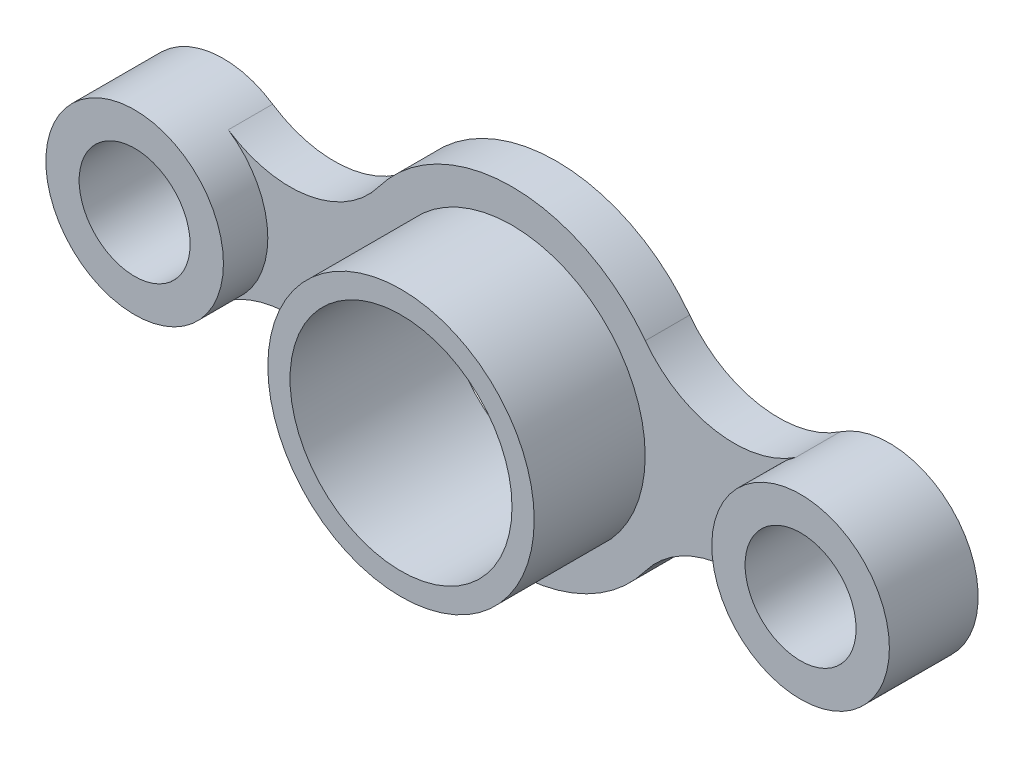
ISO-10303-21;
HEADER;
FILE_DESCRIPTION(('STEP AP214'),'2;1');
FILE_NAME('part.step','',(''),(''),'','','');
FILE_SCHEMA(('AUTOMOTIVE_DESIGN { 1 0 10303 214 1 1 1 1 }'));
ENDSEC;
DATA;
#1=APPLICATION_CONTEXT('core data for automotive mechanical design processes');
#2=APPLICATION_PROTOCOL_DEFINITION('international standard','automotive_design',2000,#1);
#3=PRODUCT_CONTEXT('',#1,'mechanical');
#4=PRODUCT('Part','Part','',(#3));
#5=PRODUCT_RELATED_PRODUCT_CATEGORY('part','',(#4));
#6=PRODUCT_DEFINITION_FORMATION('','',#4);
#7=PRODUCT_DEFINITION_CONTEXT('part definition',#1,'design');
#8=PRODUCT_DEFINITION('design','',#6,#7);
#9=PRODUCT_DEFINITION_SHAPE('','',#8);
#10=(LENGTH_UNIT() NAMED_UNIT(*) SI_UNIT(.MILLI.,.METRE.));
#11=(NAMED_UNIT(*) PLANE_ANGLE_UNIT() SI_UNIT($,.RADIAN.));
#12=(NAMED_UNIT(*) SI_UNIT($,.STERADIAN.) SOLID_ANGLE_UNIT());
#13=UNCERTAINTY_MEASURE_WITH_UNIT(LENGTH_MEASURE(1.E-05),#10,'distance_accuracy_value','');
#14=(GEOMETRIC_REPRESENTATION_CONTEXT(3) GLOBAL_UNCERTAINTY_ASSIGNED_CONTEXT((#13)) GLOBAL_UNIT_ASSIGNED_CONTEXT((#10,
#11,#12)) REPRESENTATION_CONTEXT('',''));
#15=CARTESIAN_POINT('',(0.,0.,0.));
#16=DIRECTION('',(0.,0.,1.));
#17=DIRECTION('',(1.,0.,0.));
#18=AXIS2_PLACEMENT_3D('',#15,#16,#17);
#19=CARTESIAN_POINT('',(-100.083333333333,-74.8887600971527,20.));
#20=DIRECTION('',(0.,0.,-1.));
#21=DIRECTION('',(-1.,0.,0.));
#22=AXIS2_PLACEMENT_3D('',#19,#20,#21);
#23=CYLINDRICAL_SURFACE('',#22,50.);
#24=CARTESIAN_POINT('',(-100.083333333333,-74.8887600971527,0.));
#25=DIRECTION('',(0.,0.,1.));
#26=DIRECTION('',(1.,0.,0.));
#27=AXIS2_PLACEMENT_3D('',#24,#25,#26);
#28=CIRCLE('',#27,50.);
#29=CARTESIAN_POINT('',(-127.814814814815,-33.2838933765123,0.));
#30=VERTEX_POINT('',#29);
#31=CARTESIAN_POINT('',(-60.05,-44.9332560582916,0.));
#32=VERTEX_POINT('',#31);
#33=EDGE_CURVE('E160',#30,#32,#28,.F.);
#34=ORIENTED_EDGE('',*,*,#33,.T.);
#35=DIRECTION('',(0.,0.,-1.));
#36=VECTOR('',#35,1.);
#37=CARTESIAN_POINT('',(-60.05,-44.9332560582916,20.));
#38=LINE('',#37,#36);
#39=CARTESIAN_POINT('',(-60.05,-44.9332560582916,20.));
#40=VERTEX_POINT('',#39);
#41=EDGE_CURVE('E48',#40,#32,#38,.T.);
#42=ORIENTED_EDGE('',*,*,#41,.F.);
#43=CARTESIAN_POINT('',(-100.083333333333,-74.8887600971527,20.));
#44=DIRECTION('',(0.,0.,1.));
#45=DIRECTION('',(1.,0.,0.));
#46=AXIS2_PLACEMENT_3D('',#43,#44,#45);
#47=CIRCLE('',#46,50.);
#48=CARTESIAN_POINT('',(-127.814814814815,-33.2838933765123,20.));
#49=VERTEX_POINT('',#48);
#50=EDGE_CURVE('E89',#49,#40,#47,.F.);
#51=ORIENTED_EDGE('',*,*,#50,.F.);
#52=DIRECTION('',(0.,0.,-1.));
#53=VECTOR('',#52,1.);
#54=CARTESIAN_POINT('',(-127.814814814815,-33.2838933765123,20.));
#55=LINE('',#54,#53);
#56=EDGE_CURVE('E11',#49,#30,#55,.T.);
#57=ORIENTED_EDGE('',*,*,#56,.T.);
#58=EDGE_LOOP('',(#34,#42,#51,#57));
#59=FACE_BOUND('',#58,.T.);
#60=ADVANCED_FACE('F39',(#59),#23,.F.);
#61=CARTESIAN_POINT('',(0.,0.,20.));
#62=DIRECTION('',(0.,0.,-1.));
#63=DIRECTION('',(-1.,0.,0.));
#64=AXIS2_PLACEMENT_3D('',#61,#62,#63);
#65=CYLINDRICAL_SURFACE('',#64,75.);
#66=CARTESIAN_POINT('',(0.,0.,0.));
#67=DIRECTION('',(0.,0.,1.));
#68=DIRECTION('',(1.,0.,0.));
#69=AXIS2_PLACEMENT_3D('',#66,#67,#68);
#70=CIRCLE('',#69,75.);
#71=CARTESIAN_POINT('',(60.05,-44.9332560582916,0.));
#72=VERTEX_POINT('',#71);
#73=EDGE_CURVE('E226',#32,#72,#70,.T.);
#74=ORIENTED_EDGE('',*,*,#73,.T.);
#75=DIRECTION('',(0.,0.,-1.));
#76=VECTOR('',#75,1.);
#77=CARTESIAN_POINT('',(60.05,-44.9332560582916,20.));
#78=LINE('',#77,#76);
#79=CARTESIAN_POINT('',(60.05,-44.9332560582916,20.));
#80=VERTEX_POINT('',#79);
#81=EDGE_CURVE('E231',#80,#72,#78,.T.);
#82=ORIENTED_EDGE('',*,*,#81,.F.);
#83=CARTESIAN_POINT('',(0.,0.,20.));
#84=DIRECTION('',(0.,0.,1.));
#85=DIRECTION('',(1.,0.,0.));
#86=AXIS2_PLACEMENT_3D('',#83,#84,#85);
#87=CIRCLE('',#86,75.);
#88=EDGE_CURVE('E129',#40,#80,#87,.T.);
#89=ORIENTED_EDGE('',*,*,#88,.F.);
#90=ORIENTED_EDGE('',*,*,#41,.T.);
#91=EDGE_LOOP('',(#74,#82,#89,#90));
#92=FACE_BOUND('',#91,.T.);
#93=ADVANCED_FACE('F212',(#92),#65,.T.);
#94=CARTESIAN_POINT('',(100.083333333333,-74.8887600971527,20.));
#95=DIRECTION('',(0.,0.,-1.));
#96=DIRECTION('',(-1.,0.,0.));
#97=AXIS2_PLACEMENT_3D('',#94,#95,#96);
#98=CYLINDRICAL_SURFACE('',#97,50.);
#99=CARTESIAN_POINT('',(100.083333333333,-74.8887600971527,0.));
#100=DIRECTION('',(0.,0.,1.));
#101=DIRECTION('',(1.,0.,0.));
#102=AXIS2_PLACEMENT_3D('',#99,#100,#101);
#103=CIRCLE('',#102,50.);
#104=CARTESIAN_POINT('',(127.814814814815,-33.2838933765123,0.));
#105=VERTEX_POINT('',#104);
#106=EDGE_CURVE('E235',#105,#72,#103,.T.);
#107=ORIENTED_EDGE('',*,*,#106,.F.);
#108=DIRECTION('',(0.,0.,-1.));
#109=VECTOR('',#108,1.);
#110=CARTESIAN_POINT('',(127.814814814815,-33.2838933765123,20.));
#111=LINE('',#110,#109);
#112=CARTESIAN_POINT('',(127.814814814815,-33.2838933765123,20.));
#113=VERTEX_POINT('',#112);
#114=EDGE_CURVE('E253',#113,#105,#111,.T.);
#115=ORIENTED_EDGE('',*,*,#114,.F.);
#116=CARTESIAN_POINT('',(100.083333333333,-74.8887600971527,20.));
#117=DIRECTION('',(0.,0.,1.));
#118=DIRECTION('',(1.,0.,0.));
#119=AXIS2_PLACEMENT_3D('',#116,#117,#118);
#120=CIRCLE('',#119,50.);
#121=EDGE_CURVE('E136',#113,#80,#120,.T.);
#122=ORIENTED_EDGE('',*,*,#121,.T.);
#123=ORIENTED_EDGE('',*,*,#81,.T.);
#124=EDGE_LOOP('',(#107,#115,#122,#123));
#125=FACE_BOUND('',#124,.T.);
#126=ADVANCED_FACE('F216',(#125),#98,.F.);
#127=CARTESIAN_POINT('',(100.083333333333,74.8887600971527,20.));
#128=DIRECTION('',(0.,0.,-1.));
#129=DIRECTION('',(-1.,0.,0.));
#130=AXIS2_PLACEMENT_3D('',#127,#128,#129);
#131=CYLINDRICAL_SURFACE('',#130,50.);
#132=CARTESIAN_POINT('',(100.083333333333,74.8887600971527,0.));
#133=DIRECTION('',(0.,0.,1.));
#134=DIRECTION('',(1.,0.,0.));
#135=AXIS2_PLACEMENT_3D('',#132,#133,#134);
#136=CIRCLE('',#135,50.);
#137=CARTESIAN_POINT('',(127.814814814815,33.2838933765123,0.));
#138=VERTEX_POINT('',#137);
#139=CARTESIAN_POINT('',(60.05,44.9332560582916,0.));
#140=VERTEX_POINT('',#139);
#141=EDGE_CURVE('E119',#138,#140,#136,.F.);
#142=ORIENTED_EDGE('',*,*,#141,.T.);
#143=DIRECTION('',(0.,0.,-1.));
#144=VECTOR('',#143,1.);
#145=CARTESIAN_POINT('',(60.05,44.9332560582916,20.));
#146=LINE('',#145,#144);
#147=CARTESIAN_POINT('',(60.05,44.9332560582916,20.));
#148=VERTEX_POINT('',#147);
#149=EDGE_CURVE('E116',#148,#140,#146,.T.);
#150=ORIENTED_EDGE('',*,*,#149,.F.);
#151=CARTESIAN_POINT('',(100.083333333333,74.8887600971527,20.));
#152=DIRECTION('',(0.,0.,1.));
#153=DIRECTION('',(1.,0.,0.));
#154=AXIS2_PLACEMENT_3D('',#151,#152,#153);
#155=CIRCLE('',#154,50.);
#156=CARTESIAN_POINT('',(127.814814814815,33.2838933765123,20.));
#157=VERTEX_POINT('',#156);
#158=EDGE_CURVE('E101',#157,#148,#155,.F.);
#159=ORIENTED_EDGE('',*,*,#158,.F.);
#160=DIRECTION('',(0.,0.,-1.));
#161=VECTOR('',#160,1.);
#162=CARTESIAN_POINT('',(127.814814814815,33.2838933765123,20.));
#163=LINE('',#162,#161);
#164=EDGE_CURVE('E123',#157,#138,#163,.T.);
#165=ORIENTED_EDGE('',*,*,#164,.T.);
#166=EDGE_LOOP('',(#142,#150,#159,#165));
#167=FACE_BOUND('',#166,.T.);
#168=ADVANCED_FACE('F117',(#167),#131,.F.);
#169=CARTESIAN_POINT('',(-60.05,44.9332560582916,0.));
#170=VERTEX_POINT('',#169);
#171=EDGE_CURVE('E238',#140,#170,#70,.T.);
#172=ORIENTED_EDGE('',*,*,#171,.T.);
#173=DIRECTION('',(0.,0.,-1.));
#174=VECTOR('',#173,1.);
#175=CARTESIAN_POINT('',(-60.05,44.9332560582916,20.));
#176=LINE('',#175,#174);
#177=CARTESIAN_POINT('',(-60.05,44.9332560582916,20.));
#178=VERTEX_POINT('',#177);
#179=EDGE_CURVE('E78',#178,#170,#176,.T.);
#180=ORIENTED_EDGE('',*,*,#179,.F.);
#181=EDGE_CURVE('E106',#148,#178,#87,.T.);
#182=ORIENTED_EDGE('',*,*,#181,.F.);
#183=ORIENTED_EDGE('',*,*,#149,.T.);
#184=EDGE_LOOP('',(#172,#180,#182,#183));
#185=FACE_BOUND('',#184,.T.);
#186=ADVANCED_FACE('F125',(#185),#65,.T.);
#187=CARTESIAN_POINT('',(-100.083333333333,74.8887600971527,20.));
#188=DIRECTION('',(0.,0.,-1.));
#189=DIRECTION('',(-1.,0.,0.));
#190=AXIS2_PLACEMENT_3D('',#187,#188,#189);
#191=CYLINDRICAL_SURFACE('',#190,50.);
#192=CARTESIAN_POINT('',(-100.083333333333,74.8887600971527,0.));
#193=DIRECTION('',(0.,0.,1.));
#194=DIRECTION('',(1.,0.,0.));
#195=AXIS2_PLACEMENT_3D('',#192,#193,#194);
#196=CIRCLE('',#195,50.);
#197=CARTESIAN_POINT('',(-127.814814814815,33.2838933765123,0.));
#198=VERTEX_POINT('',#197);
#199=EDGE_CURVE('E82',#198,#170,#196,.T.);
#200=ORIENTED_EDGE('',*,*,#199,.F.);
#201=DIRECTION('',(0.,0.,-1.));
#202=VECTOR('',#201,1.);
#203=CARTESIAN_POINT('',(-127.814814814815,33.2838933765123,20.));
#204=LINE('',#203,#202);
#205=CARTESIAN_POINT('',(-127.814814814815,33.2838933765123,20.));
#206=VERTEX_POINT('',#205);
#207=EDGE_CURVE('E56',#206,#198,#204,.T.);
#208=ORIENTED_EDGE('',*,*,#207,.F.);
#209=CARTESIAN_POINT('',(-100.083333333333,74.8887600971527,20.));
#210=DIRECTION('',(0.,0.,1.));
#211=DIRECTION('',(1.,0.,0.));
#212=AXIS2_PLACEMENT_3D('',#209,#210,#211);
#213=CIRCLE('',#212,50.);
#214=EDGE_CURVE('E127',#206,#178,#213,.T.);
#215=ORIENTED_EDGE('',*,*,#214,.T.);
#216=ORIENTED_EDGE('',*,*,#179,.T.);
#217=EDGE_LOOP('',(#200,#208,#215,#216));
#218=FACE_BOUND('',#217,.T.);
#219=ADVANCED_FACE('F270',(#218),#191,.F.);
#220=CARTESIAN_POINT('',(0.,0.,20.));
#221=DIRECTION('',(0.,0.,1.));
#222=DIRECTION('',(1.,0.,0.));
#223=AXIS2_PLACEMENT_3D('',#220,#221,#222);
#224=PLANE('',#223);
#225=CARTESIAN_POINT('',(-150.,0.,20.));
#226=DIRECTION('',(0.,0.,1.));
#227=DIRECTION('',(1.,0.,0.));
#228=AXIS2_PLACEMENT_3D('',#225,#226,#227);
#229=CIRCLE('',#228,40.);
#230=EDGE_CURVE('E142',#206,#49,#229,.F.);
#231=ORIENTED_EDGE('',*,*,#230,.T.);
#232=ORIENTED_EDGE('',*,*,#50,.T.);
#233=ORIENTED_EDGE('',*,*,#88,.T.);
#234=ORIENTED_EDGE('',*,*,#121,.F.);
#235=CARTESIAN_POINT('',(150.,0.,20.));
#236=DIRECTION('',(0.,0.,1.));
#237=DIRECTION('',(1.,0.,0.));
#238=AXIS2_PLACEMENT_3D('',#235,#236,#237);
#239=CIRCLE('',#238,40.);
#240=EDGE_CURVE('E110',#157,#113,#239,.T.);
#241=ORIENTED_EDGE('',*,*,#240,.F.);
#242=ORIENTED_EDGE('',*,*,#158,.T.);
#243=ORIENTED_EDGE('',*,*,#181,.T.);
#244=ORIENTED_EDGE('',*,*,#214,.F.);
#245=EDGE_LOOP('',(#231,#232,#233,#234,#241,#242,#243,#244));
#246=FACE_BOUND('',#245,.T.);
#247=CARTESIAN_POINT('',(0.,0.,20.));
#248=DIRECTION('',(0.,0.,1.));
#249=DIRECTION('',(1.,0.,0.));
#250=AXIS2_PLACEMENT_3D('',#247,#248,#249);
#251=CIRCLE('',#250,60.);
#252=CARTESIAN_POINT('',(60.,0.,20.));
#253=VERTEX_POINT('',#252);
#254=EDGE_CURVE('E131',#253,#253,#251,.T.);
#255=ORIENTED_EDGE('',*,*,#254,.F.);
#256=EDGE_LOOP('',(#255));
#257=FACE_BOUND('',#256,.T.);
#258=ADVANCED_FACE('F103',(#246,#257),#224,.T.);
#259=CARTESIAN_POINT('',(0.,0.,0.));
#260=DIRECTION('',(0.,0.,1.));
#261=DIRECTION('',(1.,0.,0.));
#262=AXIS2_PLACEMENT_3D('',#259,#260,#261);
#263=PLANE('',#262);
#264=ORIENTED_EDGE('',*,*,#33,.F.);
#265=CARTESIAN_POINT('',(-150.,0.,0.));
#266=DIRECTION('',(0.,0.,1.));
#267=DIRECTION('',(1.,0.,0.));
#268=AXIS2_PLACEMENT_3D('',#265,#266,#267);
#269=CIRCLE('',#268,40.);
#270=EDGE_CURVE('E151',#30,#198,#269,.F.);
#271=ORIENTED_EDGE('',*,*,#270,.T.);
#272=ORIENTED_EDGE('',*,*,#199,.T.);
#273=ORIENTED_EDGE('',*,*,#171,.F.);
#274=ORIENTED_EDGE('',*,*,#141,.F.);
#275=CARTESIAN_POINT('',(150.,0.,0.));
#276=DIRECTION('',(0.,0.,1.));
#277=DIRECTION('',(1.,0.,0.));
#278=AXIS2_PLACEMENT_3D('',#275,#276,#277);
#279=CIRCLE('',#278,40.);
#280=EDGE_CURVE('E164',#105,#138,#279,.T.);
#281=ORIENTED_EDGE('',*,*,#280,.F.);
#282=ORIENTED_EDGE('',*,*,#106,.T.);
#283=ORIENTED_EDGE('',*,*,#73,.F.);
#284=EDGE_LOOP('',(#264,#271,#272,#273,#274,#281,#282,#283));
#285=FACE_BOUND('',#284,.T.);
#286=CARTESIAN_POINT('',(-150.,0.,0.));
#287=DIRECTION('',(0.,0.,1.));
#288=DIRECTION('',(1.,0.,0.));
#289=AXIS2_PLACEMENT_3D('',#286,#287,#288);
#290=CIRCLE('',#289,25.);
#291=CARTESIAN_POINT('',(-125.,0.,0.));
#292=VERTEX_POINT('',#291);
#293=EDGE_CURVE('E146',#292,#292,#290,.F.);
#294=ORIENTED_EDGE('',*,*,#293,.F.);
#295=EDGE_LOOP('',(#294));
#296=FACE_BOUND('',#295,.T.);
#297=CARTESIAN_POINT('',(150.,0.,0.));
#298=DIRECTION('',(0.,0.,1.));
#299=DIRECTION('',(1.,0.,0.));
#300=AXIS2_PLACEMENT_3D('',#297,#298,#299);
#301=CIRCLE('',#300,25.);
#302=CARTESIAN_POINT('',(175.,0.,0.));
#303=VERTEX_POINT('',#302);
#304=EDGE_CURVE('E169',#303,#303,#301,.T.);
#305=ORIENTED_EDGE('',*,*,#304,.T.);
#306=EDGE_LOOP('',(#305));
#307=FACE_BOUND('',#306,.T.);
#308=CARTESIAN_POINT('',(0.,0.,0.));
#309=DIRECTION('',(0.,0.,1.));
#310=DIRECTION('',(1.,0.,0.));
#311=AXIS2_PLACEMENT_3D('',#308,#309,#310);
#312=CIRCLE('',#311,50.);
#313=CARTESIAN_POINT('',(50.,0.,0.));
#314=VERTEX_POINT('',#313);
#315=EDGE_CURVE('E180',#314,#314,#312,.T.);
#316=ORIENTED_EDGE('',*,*,#315,.T.);
#317=EDGE_LOOP('',(#316));
#318=FACE_BOUND('',#317,.T.);
#319=ADVANCED_FACE('F232',(#285,#296,#307,#318),#263,.F.);
#320=CARTESIAN_POINT('',(-150.,0.,40.));
#321=DIRECTION('',(0.,0.,-1.));
#322=DIRECTION('',(-1.,0.,0.));
#323=AXIS2_PLACEMENT_3D('',#320,#321,#322);
#324=CYLINDRICAL_SURFACE('',#323,40.);
#325=CARTESIAN_POINT('',(-150.,0.,40.));
#326=DIRECTION('',(0.,0.,1.));
#327=DIRECTION('',(1.,0.,0.));
#328=AXIS2_PLACEMENT_3D('',#325,#326,#327);
#329=CIRCLE('',#328,40.);
#330=CARTESIAN_POINT('',(-110.,0.,40.));
#331=VERTEX_POINT('',#330);
#332=EDGE_CURVE('E150',#331,#331,#329,.F.);
#333=ORIENTED_EDGE('',*,*,#332,.T.);
#334=EDGE_LOOP('',(#333));
#335=FACE_BOUND('',#334,.T.);
#336=ORIENTED_EDGE('',*,*,#56,.F.);
#337=ORIENTED_EDGE('',*,*,#230,.F.);
#338=ORIENTED_EDGE('',*,*,#207,.T.);
#339=ORIENTED_EDGE('',*,*,#270,.F.);
#340=EDGE_LOOP('',(#336,#337,#338,#339));
#341=FACE_BOUND('',#340,.T.);
#342=ADVANCED_FACE('F268',(#335,#341),#324,.T.);
#343=CARTESIAN_POINT('',(-150.,0.,40.));
#344=DIRECTION('',(0.,0.,-1.));
#345=DIRECTION('',(-1.,0.,0.));
#346=AXIS2_PLACEMENT_3D('',#343,#344,#345);
#347=CYLINDRICAL_SURFACE('',#346,25.);
#348=CARTESIAN_POINT('',(-150.,0.,40.));
#349=DIRECTION('',(0.,0.,1.));
#350=DIRECTION('',(1.,0.,0.));
#351=AXIS2_PLACEMENT_3D('',#348,#349,#350);
#352=CIRCLE('',#351,25.);
#353=CARTESIAN_POINT('',(-125.,0.,40.));
#354=VERTEX_POINT('',#353);
#355=EDGE_CURVE('E156',#354,#354,#352,.F.);
#356=ORIENTED_EDGE('',*,*,#355,.F.);
#357=EDGE_LOOP('',(#356));
#358=FACE_BOUND('',#357,.T.);
#359=ORIENTED_EDGE('',*,*,#293,.T.);
#360=EDGE_LOOP('',(#359));
#361=FACE_BOUND('',#360,.T.);
#362=ADVANCED_FACE('F316',(#358,#361),#347,.F.);
#363=CARTESIAN_POINT('',(0.,0.,40.));
#364=DIRECTION('',(0.,0.,1.));
#365=DIRECTION('',(1.,0.,0.));
#366=AXIS2_PLACEMENT_3D('',#363,#364,#365);
#367=PLANE('',#366);
#368=ORIENTED_EDGE('',*,*,#332,.F.);
#369=EDGE_LOOP('',(#368));
#370=FACE_BOUND('',#369,.T.);
#371=ORIENTED_EDGE('',*,*,#355,.T.);
#372=EDGE_LOOP('',(#371));
#373=FACE_BOUND('',#372,.T.);
#374=ADVANCED_FACE('F327',(#370,#373),#367,.T.);
#375=CARTESIAN_POINT('',(150.,0.,40.));
#376=DIRECTION('',(0.,0.,-1.));
#377=DIRECTION('',(-1.,0.,0.));
#378=AXIS2_PLACEMENT_3D('',#375,#376,#377);
#379=CYLINDRICAL_SURFACE('',#378,40.);
#380=CARTESIAN_POINT('',(150.,0.,40.));
#381=DIRECTION('',(0.,0.,1.));
#382=DIRECTION('',(1.,0.,0.));
#383=AXIS2_PLACEMENT_3D('',#380,#381,#382);
#384=CIRCLE('',#383,40.);
#385=CARTESIAN_POINT('',(190.,0.,40.));
#386=VERTEX_POINT('',#385);
#387=EDGE_CURVE('E155',#386,#386,#384,.T.);
#388=ORIENTED_EDGE('',*,*,#387,.F.);
#389=EDGE_LOOP('',(#388));
#390=FACE_BOUND('',#389,.T.);
#391=ORIENTED_EDGE('',*,*,#240,.T.);
#392=ORIENTED_EDGE('',*,*,#114,.T.);
#393=ORIENTED_EDGE('',*,*,#280,.T.);
#394=ORIENTED_EDGE('',*,*,#164,.F.);
#395=EDGE_LOOP('',(#391,#392,#393,#394));
#396=FACE_BOUND('',#395,.T.);
#397=ADVANCED_FACE('F266',(#390,#396),#379,.T.);
#398=CARTESIAN_POINT('',(150.,0.,40.));
#399=DIRECTION('',(0.,0.,-1.));
#400=DIRECTION('',(-1.,0.,0.));
#401=AXIS2_PLACEMENT_3D('',#398,#399,#400);
#402=CYLINDRICAL_SURFACE('',#401,25.);
#403=CARTESIAN_POINT('',(150.,0.,40.));
#404=DIRECTION('',(0.,0.,1.));
#405=DIRECTION('',(1.,0.,0.));
#406=AXIS2_PLACEMENT_3D('',#403,#404,#405);
#407=CIRCLE('',#406,25.);
#408=CARTESIAN_POINT('',(175.,0.,40.));
#409=VERTEX_POINT('',#408);
#410=EDGE_CURVE('E168',#409,#409,#407,.T.);
#411=ORIENTED_EDGE('',*,*,#410,.T.);
#412=EDGE_LOOP('',(#411));
#413=FACE_BOUND('',#412,.T.);
#414=ORIENTED_EDGE('',*,*,#304,.F.);
#415=EDGE_LOOP('',(#414));
#416=FACE_BOUND('',#415,.T.);
#417=ADVANCED_FACE('F346',(#413,#416),#402,.F.);
#418=CARTESIAN_POINT('',(0.,0.,40.));
#419=DIRECTION('',(0.,0.,1.));
#420=DIRECTION('',(1.,0.,0.));
#421=AXIS2_PLACEMENT_3D('',#418,#419,#420);
#422=PLANE('',#421);
#423=ORIENTED_EDGE('',*,*,#410,.F.);
#424=EDGE_LOOP('',(#423));
#425=FACE_BOUND('',#424,.T.);
#426=ORIENTED_EDGE('',*,*,#387,.T.);
#427=EDGE_LOOP('',(#426));
#428=FACE_BOUND('',#427,.T.);
#429=ADVANCED_FACE('F208',(#425,#428),#422,.T.);
#430=CARTESIAN_POINT('',(0.,0.,70.));
#431=DIRECTION('',(0.,0.,-1.));
#432=DIRECTION('',(-1.,0.,0.));
#433=AXIS2_PLACEMENT_3D('',#430,#431,#432);
#434=CYLINDRICAL_SURFACE('',#433,50.);
#435=CARTESIAN_POINT('',(0.,0.,70.));
#436=DIRECTION('',(0.,0.,1.));
#437=DIRECTION('',(1.,0.,0.));
#438=AXIS2_PLACEMENT_3D('',#435,#436,#437);
#439=CIRCLE('',#438,50.);
#440=CARTESIAN_POINT('',(50.,0.,70.));
#441=VERTEX_POINT('',#440);
#442=EDGE_CURVE('E184',#441,#441,#439,.T.);
#443=ORIENTED_EDGE('',*,*,#442,.T.);
#444=EDGE_LOOP('',(#443));
#445=FACE_BOUND('',#444,.T.);
#446=ORIENTED_EDGE('',*,*,#315,.F.);
#447=EDGE_LOOP('',(#446));
#448=FACE_BOUND('',#447,.T.);
#449=ADVANCED_FACE('F192',(#445,#448),#434,.F.);
#450=CARTESIAN_POINT('',(0.,0.,70.));
#451=DIRECTION('',(0.,0.,-1.));
#452=DIRECTION('',(-1.,0.,0.));
#453=AXIS2_PLACEMENT_3D('',#450,#451,#452);
#454=CYLINDRICAL_SURFACE('',#453,60.);
#455=ORIENTED_EDGE('',*,*,#254,.T.);
#456=EDGE_LOOP('',(#455));
#457=FACE_BOUND('',#456,.T.);
#458=CARTESIAN_POINT('',(0.,0.,70.));
#459=DIRECTION('',(0.,0.,1.));
#460=DIRECTION('',(1.,0.,0.));
#461=AXIS2_PLACEMENT_3D('',#458,#459,#460);
#462=CIRCLE('',#461,60.);
#463=CARTESIAN_POINT('',(60.,0.,70.));
#464=VERTEX_POINT('',#463);
#465=EDGE_CURVE('E173',#464,#464,#462,.T.);
#466=ORIENTED_EDGE('',*,*,#465,.F.);
#467=EDGE_LOOP('',(#466));
#468=FACE_BOUND('',#467,.T.);
#469=ADVANCED_FACE('F198',(#457,#468),#454,.T.);
#470=CARTESIAN_POINT('',(0.,0.,70.));
#471=DIRECTION('',(0.,0.,1.));
#472=DIRECTION('',(1.,0.,0.));
#473=AXIS2_PLACEMENT_3D('',#470,#471,#472);
#474=PLANE('',#473);
#475=ORIENTED_EDGE('',*,*,#442,.F.);
#476=EDGE_LOOP('',(#475));
#477=FACE_BOUND('',#476,.T.);
#478=ORIENTED_EDGE('',*,*,#465,.T.);
#479=EDGE_LOOP('',(#478));
#480=FACE_BOUND('',#479,.T.);
#481=ADVANCED_FACE('F195',(#477,#480),#474,.T.);
#482=CLOSED_SHELL('',(#60,#93,#126,#168,#186,#219,#258,#319,#342,#362,#374,#397,#417,#429,#449,
#469,#481));
#483=MANIFOLD_SOLID_BREP('B2',#482);
#484=ADVANCED_BREP_SHAPE_REPRESENTATION('',(#18,#483),#14);
#485=SHAPE_DEFINITION_REPRESENTATION(#9,#484);
ENDSEC;
END-ISO-10303-21;
